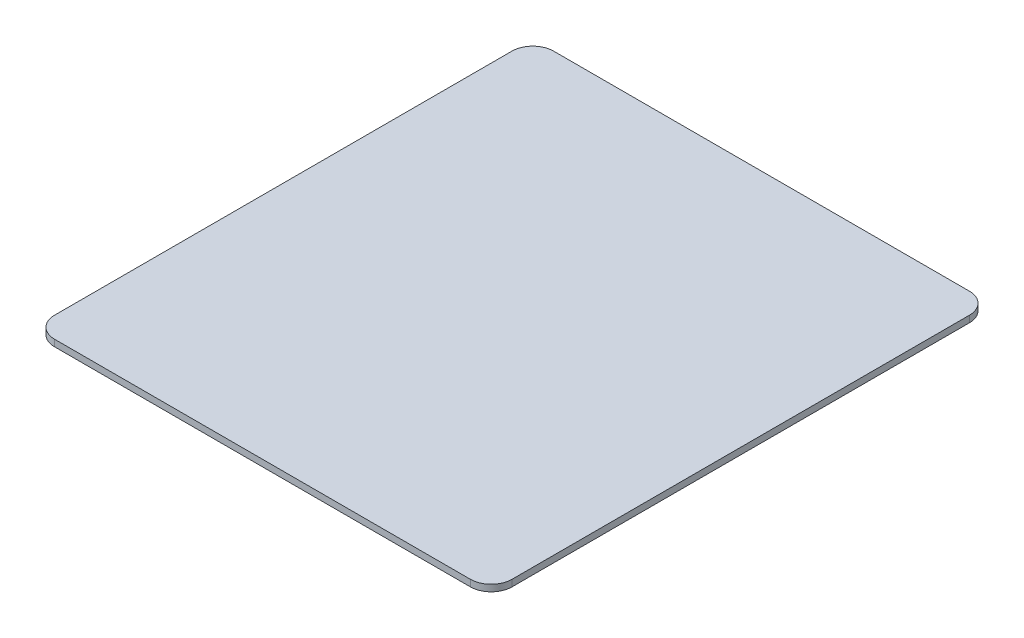
ISO-10303-21;
HEADER;
FILE_DESCRIPTION(('STEP AP214'),'2;1');
FILE_NAME('part.step','',(''),(''),'','','');
FILE_SCHEMA(('AUTOMOTIVE_DESIGN { 1 0 10303 214 1 1 1 1 }'));
ENDSEC;
DATA;
#1=APPLICATION_CONTEXT('core data for automotive mechanical design processes');
#2=APPLICATION_PROTOCOL_DEFINITION('international standard','automotive_design',2000,#1);
#3=PRODUCT_CONTEXT('',#1,'mechanical');
#4=PRODUCT('Part','Part','',(#3));
#5=PRODUCT_RELATED_PRODUCT_CATEGORY('part','',(#4));
#6=PRODUCT_DEFINITION_FORMATION('','',#4);
#7=PRODUCT_DEFINITION_CONTEXT('part definition',#1,'design');
#8=PRODUCT_DEFINITION('design','',#6,#7);
#9=PRODUCT_DEFINITION_SHAPE('','',#8);
#10=(LENGTH_UNIT() NAMED_UNIT(*) SI_UNIT(.MILLI.,.METRE.));
#11=(NAMED_UNIT(*) PLANE_ANGLE_UNIT() SI_UNIT($,.RADIAN.));
#12=(NAMED_UNIT(*) SI_UNIT($,.STERADIAN.) SOLID_ANGLE_UNIT());
#13=UNCERTAINTY_MEASURE_WITH_UNIT(LENGTH_MEASURE(1.E-05),#10,'distance_accuracy_value','');
#14=(GEOMETRIC_REPRESENTATION_CONTEXT(3) GLOBAL_UNCERTAINTY_ASSIGNED_CONTEXT((#13)) GLOBAL_UNIT_ASSIGNED_CONTEXT((#10,
#11,#12)) REPRESENTATION_CONTEXT('',''));
#15=CARTESIAN_POINT('',(0.,0.,0.));
#16=DIRECTION('',(0.,0.,1.));
#17=DIRECTION('',(1.,0.,0.));
#18=AXIS2_PLACEMENT_3D('',#15,#16,#17);
#19=CARTESIAN_POINT('',(210.,3.175,-10.));
#20=DIRECTION('',(0.,-1.,0.));
#21=DIRECTION('',(0.,0.,-1.));
#22=AXIS2_PLACEMENT_3D('',#19,#20,#21);
#23=CYLINDRICAL_SURFACE('',#22,10.);
#24=CARTESIAN_POINT('',(210.,0.,-10.));
#25=DIRECTION('',(0.,1.,0.));
#26=DIRECTION('',(0.,0.,1.));
#27=AXIS2_PLACEMENT_3D('',#24,#25,#26);
#28=CIRCLE('',#27,10.);
#29=CARTESIAN_POINT('',(210.,0.,0.));
#30=VERTEX_POINT('',#29);
#31=CARTESIAN_POINT('',(220.,0.,-10.));
#32=VERTEX_POINT('',#31);
#33=EDGE_CURVE('E140',#30,#32,#28,.T.);
#34=ORIENTED_EDGE('',*,*,#33,.T.);
#35=DIRECTION('',(0.,-1.,0.));
#36=VECTOR('',#35,1.);
#37=CARTESIAN_POINT('',(220.,3.175,-10.));
#38=LINE('',#37,#36);
#39=CARTESIAN_POINT('',(220.,3.175,-10.));
#40=VERTEX_POINT('',#39);
#41=EDGE_CURVE('E11',#40,#32,#38,.T.);
#42=ORIENTED_EDGE('',*,*,#41,.F.);
#43=CARTESIAN_POINT('',(210.,3.175,-10.));
#44=DIRECTION('',(0.,1.,0.));
#45=DIRECTION('',(0.,0.,1.));
#46=AXIS2_PLACEMENT_3D('',#43,#44,#45);
#47=CIRCLE('',#46,10.);
#48=CARTESIAN_POINT('',(210.,3.175,0.));
#49=VERTEX_POINT('',#48);
#50=EDGE_CURVE('E162',#49,#40,#47,.T.);
#51=ORIENTED_EDGE('',*,*,#50,.F.);
#52=DIRECTION('',(0.,-1.,0.));
#53=VECTOR('',#52,1.);
#54=CARTESIAN_POINT('',(210.,3.175,0.));
#55=LINE('',#54,#53);
#56=EDGE_CURVE('E136',#49,#30,#55,.T.);
#57=ORIENTED_EDGE('',*,*,#56,.T.);
#58=EDGE_LOOP('',(#34,#42,#51,#57));
#59=FACE_BOUND('',#58,.T.);
#60=ADVANCED_FACE('F39',(#59),#23,.T.);
#61=CARTESIAN_POINT('',(220.,3.175,-10.));
#62=DIRECTION('',(-1.,0.,0.));
#63=DIRECTION('',(0.,0.,1.));
#64=AXIS2_PLACEMENT_3D('',#61,#62,#63);
#65=PLANE('',#64);
#66=DIRECTION('',(0.,0.,-1.));
#67=VECTOR('',#66,1.);
#68=CARTESIAN_POINT('',(220.,0.,-10.));
#69=LINE('',#68,#67);
#70=CARTESIAN_POINT('',(220.,0.,-230.));
#71=VERTEX_POINT('',#70);
#72=EDGE_CURVE('E144',#32,#71,#69,.T.);
#73=ORIENTED_EDGE('',*,*,#72,.T.);
#74=DIRECTION('',(0.,-1.,0.));
#75=VECTOR('',#74,1.);
#76=CARTESIAN_POINT('',(220.,3.175,-230.));
#77=LINE('',#76,#75);
#78=CARTESIAN_POINT('',(220.,3.175,-230.));
#79=VERTEX_POINT('',#78);
#80=EDGE_CURVE('E48',#79,#71,#77,.T.);
#81=ORIENTED_EDGE('',*,*,#80,.F.);
#82=DIRECTION('',(0.,0.,-1.));
#83=VECTOR('',#82,1.);
#84=CARTESIAN_POINT('',(220.,3.175,-10.));
#85=LINE('',#84,#83);
#86=EDGE_CURVE('E99',#40,#79,#85,.T.);
#87=ORIENTED_EDGE('',*,*,#86,.F.);
#88=ORIENTED_EDGE('',*,*,#41,.T.);
#89=EDGE_LOOP('',(#73,#81,#87,#88));
#90=FACE_BOUND('',#89,.T.);
#91=ADVANCED_FACE('F208',(#90),#65,.F.);
#92=CARTESIAN_POINT('',(210.,3.175,-230.));
#93=DIRECTION('',(0.,-1.,0.));
#94=DIRECTION('',(0.,0.,-1.));
#95=AXIS2_PLACEMENT_3D('',#92,#93,#94);
#96=CYLINDRICAL_SURFACE('',#95,10.);
#97=CARTESIAN_POINT('',(210.,0.,-230.));
#98=DIRECTION('',(0.,1.,0.));
#99=DIRECTION('',(0.,0.,-1.));
#100=AXIS2_PLACEMENT_3D('',#97,#98,#99);
#101=CIRCLE('',#100,10.);
#102=CARTESIAN_POINT('',(210.,0.,-240.));
#103=VERTEX_POINT('',#102);
#104=EDGE_CURVE('E147',#71,#103,#101,.T.);
#105=ORIENTED_EDGE('',*,*,#104,.T.);
#106=DIRECTION('',(0.,-1.,0.));
#107=VECTOR('',#106,1.);
#108=CARTESIAN_POINT('',(210.,3.175,-240.));
#109=LINE('',#108,#107);
#110=CARTESIAN_POINT('',(210.,3.175,-240.));
#111=VERTEX_POINT('',#110);
#112=EDGE_CURVE('E173',#111,#103,#109,.T.);
#113=ORIENTED_EDGE('',*,*,#112,.F.);
#114=CARTESIAN_POINT('',(210.,3.175,-230.));
#115=DIRECTION('',(0.,1.,0.));
#116=DIRECTION('',(0.,0.,-1.));
#117=AXIS2_PLACEMENT_3D('',#114,#115,#116);
#118=CIRCLE('',#117,10.);
#119=EDGE_CURVE('E183',#79,#111,#118,.T.);
#120=ORIENTED_EDGE('',*,*,#119,.F.);
#121=ORIENTED_EDGE('',*,*,#80,.T.);
#122=EDGE_LOOP('',(#105,#113,#120,#121));
#123=FACE_BOUND('',#122,.T.);
#124=ADVANCED_FACE('F181',(#123),#96,.T.);
#125=CARTESIAN_POINT('',(10.0000000000001,3.175,-240.));
#126=DIRECTION('',(0.,0.,1.));
#127=DIRECTION('',(1.,0.,0.));
#128=AXIS2_PLACEMENT_3D('',#125,#126,#127);
#129=PLANE('',#128);
#130=DIRECTION('',(-1.,0.,0.));
#131=VECTOR('',#130,1.);
#132=CARTESIAN_POINT('',(10.0000000000001,0.,-240.));
#133=LINE('',#132,#131);
#134=CARTESIAN_POINT('',(10.,0.,-240.));
#135=VERTEX_POINT('',#134);
#136=EDGE_CURVE('E150',#103,#135,#133,.T.);
#137=ORIENTED_EDGE('',*,*,#136,.T.);
#138=DIRECTION('',(0.,-1.,0.));
#139=VECTOR('',#138,1.);
#140=CARTESIAN_POINT('',(10.,3.175,-240.));
#141=LINE('',#140,#139);
#142=CARTESIAN_POINT('',(10.,3.175,-240.));
#143=VERTEX_POINT('',#142);
#144=EDGE_CURVE('E169',#143,#135,#141,.T.);
#145=ORIENTED_EDGE('',*,*,#144,.F.);
#146=DIRECTION('',(-1.,0.,0.));
#147=VECTOR('',#146,1.);
#148=CARTESIAN_POINT('',(10.0000000000001,3.175,-240.));
#149=LINE('',#148,#147);
#150=EDGE_CURVE('E196',#111,#143,#149,.T.);
#151=ORIENTED_EDGE('',*,*,#150,.F.);
#152=ORIENTED_EDGE('',*,*,#112,.T.);
#153=EDGE_LOOP('',(#137,#145,#151,#152));
#154=FACE_BOUND('',#153,.T.);
#155=ADVANCED_FACE('F191',(#154),#129,.F.);
#156=CARTESIAN_POINT('',(10.,3.175,-230.));
#157=DIRECTION('',(0.,-1.,0.));
#158=DIRECTION('',(0.,0.,-1.));
#159=AXIS2_PLACEMENT_3D('',#156,#157,#158);
#160=CYLINDRICAL_SURFACE('',#159,10.);
#161=CARTESIAN_POINT('',(10.,0.,-230.));
#162=DIRECTION('',(0.,1.,0.));
#163=DIRECTION('',(0.,0.,-1.));
#164=AXIS2_PLACEMENT_3D('',#161,#162,#163);
#165=CIRCLE('',#164,10.);
#166=CARTESIAN_POINT('',(0.,0.,-230.));
#167=VERTEX_POINT('',#166);
#168=EDGE_CURVE('E153',#135,#167,#165,.T.);
#169=ORIENTED_EDGE('',*,*,#168,.T.);
#170=DIRECTION('',(0.,-1.,0.));
#171=VECTOR('',#170,1.);
#172=CARTESIAN_POINT('',(0.,3.175,-230.));
#173=LINE('',#172,#171);
#174=CARTESIAN_POINT('',(0.,3.175,-230.));
#175=VERTEX_POINT('',#174);
#176=EDGE_CURVE('E129',#175,#167,#173,.T.);
#177=ORIENTED_EDGE('',*,*,#176,.F.);
#178=CARTESIAN_POINT('',(10.,3.175,-230.));
#179=DIRECTION('',(0.,1.,0.));
#180=DIRECTION('',(0.,0.,-1.));
#181=AXIS2_PLACEMENT_3D('',#178,#179,#180);
#182=CIRCLE('',#181,10.);
#183=EDGE_CURVE('E118',#143,#175,#182,.T.);
#184=ORIENTED_EDGE('',*,*,#183,.F.);
#185=ORIENTED_EDGE('',*,*,#144,.T.);
#186=EDGE_LOOP('',(#169,#177,#184,#185));
#187=FACE_BOUND('',#186,.T.);
#188=ADVANCED_FACE('F194',(#187),#160,.T.);
#189=CARTESIAN_POINT('',(0.,3.175,-10.0000000000001));
#190=DIRECTION('',(1.,0.,0.));
#191=DIRECTION('',(0.,0.,-1.));
#192=AXIS2_PLACEMENT_3D('',#189,#190,#191);
#193=PLANE('',#192);
#194=DIRECTION('',(0.,0.,1.));
#195=VECTOR('',#194,1.);
#196=CARTESIAN_POINT('',(0.,0.,-10.0000000000001));
#197=LINE('',#196,#195);
#198=CARTESIAN_POINT('',(0.,0.,-10.0000000000001));
#199=VERTEX_POINT('',#198);
#200=EDGE_CURVE('E127',#167,#199,#197,.T.);
#201=ORIENTED_EDGE('',*,*,#200,.T.);
#202=DIRECTION('',(0.,-1.,0.));
#203=VECTOR('',#202,1.);
#204=CARTESIAN_POINT('',(0.,3.175,-10.0000000000001));
#205=LINE('',#204,#203);
#206=CARTESIAN_POINT('',(0.,3.175,-10.0000000000001));
#207=VERTEX_POINT('',#206);
#208=EDGE_CURVE('E124',#207,#199,#205,.T.);
#209=ORIENTED_EDGE('',*,*,#208,.F.);
#210=DIRECTION('',(0.,0.,1.));
#211=VECTOR('',#210,1.);
#212=CARTESIAN_POINT('',(0.,3.175,-10.0000000000001));
#213=LINE('',#212,#211);
#214=EDGE_CURVE('E112',#175,#207,#213,.T.);
#215=ORIENTED_EDGE('',*,*,#214,.F.);
#216=ORIENTED_EDGE('',*,*,#176,.T.);
#217=EDGE_LOOP('',(#201,#209,#215,#216));
#218=FACE_BOUND('',#217,.T.);
#219=ADVANCED_FACE('F125',(#218),#193,.F.);
#220=CARTESIAN_POINT('',(10.,3.175,-10.));
#221=DIRECTION('',(0.,-1.,0.));
#222=DIRECTION('',(0.,0.,-1.));
#223=AXIS2_PLACEMENT_3D('',#220,#221,#222);
#224=CYLINDRICAL_SURFACE('',#223,10.);
#225=CARTESIAN_POINT('',(10.,0.,-10.));
#226=DIRECTION('',(0.,1.,0.));
#227=DIRECTION('',(0.,0.,-1.));
#228=AXIS2_PLACEMENT_3D('',#225,#226,#227);
#229=CIRCLE('',#228,10.);
#230=CARTESIAN_POINT('',(10.0000000000001,0.,0.));
#231=VERTEX_POINT('',#230);
#232=EDGE_CURVE('E85',#199,#231,#229,.T.);
#233=ORIENTED_EDGE('',*,*,#232,.T.);
#234=DIRECTION('',(0.,-1.,0.));
#235=VECTOR('',#234,1.);
#236=CARTESIAN_POINT('',(10.0000000000001,3.175,0.));
#237=LINE('',#236,#235);
#238=CARTESIAN_POINT('',(10.0000000000001,3.175,0.));
#239=VERTEX_POINT('',#238);
#240=EDGE_CURVE('E130',#239,#231,#237,.T.);
#241=ORIENTED_EDGE('',*,*,#240,.F.);
#242=CARTESIAN_POINT('',(10.,3.175,-10.));
#243=DIRECTION('',(0.,1.,0.));
#244=DIRECTION('',(0.,0.,-1.));
#245=AXIS2_PLACEMENT_3D('',#242,#243,#244);
#246=CIRCLE('',#245,10.);
#247=EDGE_CURVE('E116',#207,#239,#246,.T.);
#248=ORIENTED_EDGE('',*,*,#247,.F.);
#249=ORIENTED_EDGE('',*,*,#208,.T.);
#250=EDGE_LOOP('',(#233,#241,#248,#249));
#251=FACE_BOUND('',#250,.T.);
#252=ADVANCED_FACE('F132',(#251),#224,.T.);
#253=CARTESIAN_POINT('',(10.0000000000001,3.175,0.));
#254=DIRECTION('',(0.,0.,-1.));
#255=DIRECTION('',(-1.,0.,0.));
#256=AXIS2_PLACEMENT_3D('',#253,#254,#255);
#257=PLANE('',#256);
#258=DIRECTION('',(1.,0.,0.));
#259=VECTOR('',#258,1.);
#260=CARTESIAN_POINT('',(10.0000000000001,0.,0.));
#261=LINE('',#260,#259);
#262=EDGE_CURVE('E91',#231,#30,#261,.T.);
#263=ORIENTED_EDGE('',*,*,#262,.T.);
#264=ORIENTED_EDGE('',*,*,#56,.F.);
#265=DIRECTION('',(1.,0.,0.));
#266=VECTOR('',#265,1.);
#267=CARTESIAN_POINT('',(10.0000000000001,3.175,0.));
#268=LINE('',#267,#266);
#269=EDGE_CURVE('E56',#239,#49,#268,.T.);
#270=ORIENTED_EDGE('',*,*,#269,.F.);
#271=ORIENTED_EDGE('',*,*,#240,.T.);
#272=EDGE_LOOP('',(#263,#264,#270,#271));
#273=FACE_BOUND('',#272,.T.);
#274=ADVANCED_FACE('F224',(#273),#257,.F.);
#275=CARTESIAN_POINT('',(210.,3.175,-10.));
#276=DIRECTION('',(0.,1.,0.));
#277=DIRECTION('',(0.,0.,1.));
#278=AXIS2_PLACEMENT_3D('',#275,#276,#277);
#279=PLANE('',#278);
#280=ORIENTED_EDGE('',*,*,#50,.T.);
#281=ORIENTED_EDGE('',*,*,#86,.T.);
#282=ORIENTED_EDGE('',*,*,#119,.T.);
#283=ORIENTED_EDGE('',*,*,#150,.T.);
#284=ORIENTED_EDGE('',*,*,#183,.T.);
#285=ORIENTED_EDGE('',*,*,#214,.T.);
#286=ORIENTED_EDGE('',*,*,#247,.T.);
#287=ORIENTED_EDGE('',*,*,#269,.T.);
#288=EDGE_LOOP('',(#280,#281,#282,#283,#284,#285,#286,#287));
#289=FACE_BOUND('',#288,.T.);
#290=ADVANCED_FACE('F114',(#289),#279,.T.);
#291=CARTESIAN_POINT('',(210.,0.,-10.));
#292=DIRECTION('',(0.,1.,0.));
#293=DIRECTION('',(0.,0.,1.));
#294=AXIS2_PLACEMENT_3D('',#291,#292,#293);
#295=PLANE('',#294);
#296=ORIENTED_EDGE('',*,*,#33,.F.);
#297=ORIENTED_EDGE('',*,*,#262,.F.);
#298=ORIENTED_EDGE('',*,*,#232,.F.);
#299=ORIENTED_EDGE('',*,*,#200,.F.);
#300=ORIENTED_EDGE('',*,*,#168,.F.);
#301=ORIENTED_EDGE('',*,*,#136,.F.);
#302=ORIENTED_EDGE('',*,*,#104,.F.);
#303=ORIENTED_EDGE('',*,*,#72,.F.);
#304=EDGE_LOOP('',(#296,#297,#298,#299,#300,#301,#302,#303));
#305=FACE_BOUND('',#304,.T.);
#306=ADVANCED_FACE('F187',(#305),#295,.F.);
#307=CLOSED_SHELL('',(#60,#91,#124,#155,#188,#219,#252,#274,#290,#306));
#308=MANIFOLD_SOLID_BREP('B2',#307);
#309=ADVANCED_BREP_SHAPE_REPRESENTATION('',(#18,#308),#14);
#310=SHAPE_DEFINITION_REPRESENTATION(#9,#309);
ENDSEC;
END-ISO-10303-21;
